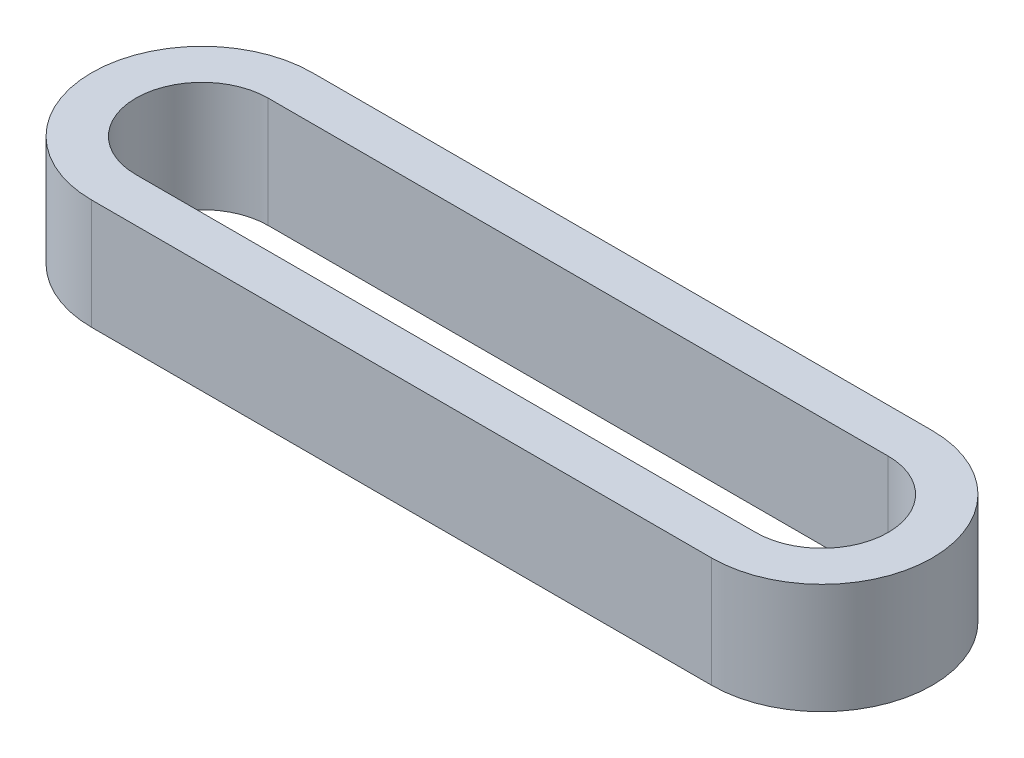
ISO-10303-21;
HEADER;
FILE_DESCRIPTION(('STEP AP214'),'2;1');
FILE_NAME('part.step','',(''),(''),'','','');
FILE_SCHEMA(('AUTOMOTIVE_DESIGN { 1 0 10303 214 1 1 1 1 }'));
ENDSEC;
DATA;
#1=APPLICATION_CONTEXT('core data for automotive mechanical design processes');
#2=APPLICATION_PROTOCOL_DEFINITION('international standard','automotive_design',2000,#1);
#3=PRODUCT_CONTEXT('',#1,'mechanical');
#4=PRODUCT('Part','Part','',(#3));
#5=PRODUCT_RELATED_PRODUCT_CATEGORY('part','',(#4));
#6=PRODUCT_DEFINITION_FORMATION('','',#4);
#7=PRODUCT_DEFINITION_CONTEXT('part definition',#1,'design');
#8=PRODUCT_DEFINITION('design','',#6,#7);
#9=PRODUCT_DEFINITION_SHAPE('','',#8);
#10=(LENGTH_UNIT() NAMED_UNIT(*) SI_UNIT(.MILLI.,.METRE.));
#11=(NAMED_UNIT(*) PLANE_ANGLE_UNIT() SI_UNIT($,.RADIAN.));
#12=(NAMED_UNIT(*) SI_UNIT($,.STERADIAN.) SOLID_ANGLE_UNIT());
#13=UNCERTAINTY_MEASURE_WITH_UNIT(LENGTH_MEASURE(1.E-05),#10,'distance_accuracy_value','');
#14=(GEOMETRIC_REPRESENTATION_CONTEXT(3) GLOBAL_UNCERTAINTY_ASSIGNED_CONTEXT((#13)) GLOBAL_UNIT_ASSIGNED_CONTEXT((#10,
#11,#12)) REPRESENTATION_CONTEXT('',''));
#15=CARTESIAN_POINT('',(0.,0.,0.));
#16=DIRECTION('',(0.,0.,1.));
#17=DIRECTION('',(1.,0.,0.));
#18=AXIS2_PLACEMENT_3D('',#15,#16,#17);
#19=CARTESIAN_POINT('',(-7.025,2.5,0.));
#20=DIRECTION('',(0.,1.,0.));
#21=DIRECTION('',(0.,0.,1.));
#22=AXIS2_PLACEMENT_3D('',#19,#20,#21);
#23=PLANE('',#22);
#24=CARTESIAN_POINT('',(-7.025,2.5,0.));
#25=DIRECTION('',(0.,1.,0.));
#26=DIRECTION('',(0.,0.,1.));
#27=AXIS2_PLACEMENT_3D('',#24,#25,#26);
#28=CIRCLE('',#27,2.5);
#29=CARTESIAN_POINT('',(-7.025,2.5,-2.5));
#30=VERTEX_POINT('',#29);
#31=CARTESIAN_POINT('',(-7.025,2.5,2.5));
#32=VERTEX_POINT('',#31);
#33=EDGE_CURVE('E177',#30,#32,#28,.T.);
#34=ORIENTED_EDGE('',*,*,#33,.T.);
#35=DIRECTION('',(1.,0.,0.));
#36=VECTOR('',#35,1.);
#37=CARTESIAN_POINT('',(-7.025,2.5,2.5));
#38=LINE('',#37,#36);
#39=CARTESIAN_POINT('',(7.025,2.5,2.5));
#40=VERTEX_POINT('',#39);
#41=EDGE_CURVE('E181',#32,#40,#38,.T.);
#42=ORIENTED_EDGE('',*,*,#41,.T.);
#43=CARTESIAN_POINT('',(7.025,2.5,0.));
#44=DIRECTION('',(0.,1.,0.));
#45=DIRECTION('',(0.,0.,1.));
#46=AXIS2_PLACEMENT_3D('',#43,#44,#45);
#47=CIRCLE('',#46,2.5);
#48=CARTESIAN_POINT('',(7.025,2.5,-2.5));
#49=VERTEX_POINT('',#48);
#50=EDGE_CURVE('E185',#40,#49,#47,.T.);
#51=ORIENTED_EDGE('',*,*,#50,.T.);
#52=DIRECTION('',(-1.,0.,0.));
#53=VECTOR('',#52,1.);
#54=CARTESIAN_POINT('',(-7.025,2.5,-2.5));
#55=LINE('',#54,#53);
#56=EDGE_CURVE('E188',#49,#30,#55,.T.);
#57=ORIENTED_EDGE('',*,*,#56,.T.);
#58=EDGE_LOOP('',(#34,#42,#51,#57));
#59=FACE_BOUND('',#58,.T.);
#60=DIRECTION('',(1.,0.,0.));
#61=VECTOR('',#60,1.);
#62=CARTESIAN_POINT('',(-7.025,2.5,1.5));
#63=LINE('',#62,#61);
#64=CARTESIAN_POINT('',(-7.025,2.5,1.5));
#65=VERTEX_POINT('',#64);
#66=CARTESIAN_POINT('',(7.025,2.5,1.5));
#67=VERTEX_POINT('',#66);
#68=EDGE_CURVE('E138',#65,#67,#63,.T.);
#69=ORIENTED_EDGE('',*,*,#68,.F.);
#70=CARTESIAN_POINT('',(-7.025,2.5,0.));
#71=DIRECTION('',(0.,1.,0.));
#72=DIRECTION('',(1.,0.,0.));
#73=AXIS2_PLACEMENT_3D('',#70,#71,#72);
#74=CIRCLE('',#73,1.5);
#75=CARTESIAN_POINT('',(-7.025,2.5,-1.5));
#76=VERTEX_POINT('',#75);
#77=EDGE_CURVE('E129',#76,#65,#74,.T.);
#78=ORIENTED_EDGE('',*,*,#77,.F.);
#79=DIRECTION('',(-1.,0.,0.));
#80=VECTOR('',#79,1.);
#81=CARTESIAN_POINT('',(-7.025,2.5,-1.5));
#82=LINE('',#81,#80);
#83=CARTESIAN_POINT('',(7.025,2.5,-1.5));
#84=VERTEX_POINT('',#83);
#85=EDGE_CURVE('E155',#84,#76,#82,.T.);
#86=ORIENTED_EDGE('',*,*,#85,.F.);
#87=CARTESIAN_POINT('',(7.025,2.5,0.));
#88=DIRECTION('',(0.,1.,0.));
#89=DIRECTION('',(1.,0.,0.));
#90=AXIS2_PLACEMENT_3D('',#87,#88,#89);
#91=CIRCLE('',#90,1.5);
#92=EDGE_CURVE('E151',#67,#84,#91,.T.);
#93=ORIENTED_EDGE('',*,*,#92,.F.);
#94=EDGE_LOOP('',(#69,#78,#86,#93));
#95=FACE_BOUND('',#94,.T.);
#96=ADVANCED_FACE('F63',(#59,#95),#23,.T.);
#97=CARTESIAN_POINT('',(-7.025,0.,0.));
#98=DIRECTION('',(0.,1.,0.));
#99=DIRECTION('',(0.,0.,1.));
#100=AXIS2_PLACEMENT_3D('',#97,#98,#99);
#101=PLANE('',#100);
#102=CARTESIAN_POINT('',(-7.025,0.,0.));
#103=DIRECTION('',(0.,1.,0.));
#104=DIRECTION('',(0.,0.,1.));
#105=AXIS2_PLACEMENT_3D('',#102,#103,#104);
#106=CIRCLE('',#105,2.5);
#107=CARTESIAN_POINT('',(-7.025,0.,-2.5));
#108=VERTEX_POINT('',#107);
#109=CARTESIAN_POINT('',(-7.025,0.,2.5));
#110=VERTEX_POINT('',#109);
#111=EDGE_CURVE('E147',#108,#110,#106,.T.);
#112=ORIENTED_EDGE('',*,*,#111,.F.);
#113=DIRECTION('',(-1.,0.,0.));
#114=VECTOR('',#113,1.);
#115=CARTESIAN_POINT('',(-7.025,0.,-2.5));
#116=LINE('',#115,#114);
#117=CARTESIAN_POINT('',(7.025,0.,-2.5));
#118=VERTEX_POINT('',#117);
#119=EDGE_CURVE('E182',#118,#108,#116,.T.);
#120=ORIENTED_EDGE('',*,*,#119,.F.);
#121=CARTESIAN_POINT('',(7.025,0.,0.));
#122=DIRECTION('',(0.,1.,0.));
#123=DIRECTION('',(0.,0.,1.));
#124=AXIS2_PLACEMENT_3D('',#121,#122,#123);
#125=CIRCLE('',#124,2.5);
#126=CARTESIAN_POINT('',(7.025,0.,2.5));
#127=VERTEX_POINT('',#126);
#128=EDGE_CURVE('E198',#127,#118,#125,.T.);
#129=ORIENTED_EDGE('',*,*,#128,.F.);
#130=DIRECTION('',(1.,0.,0.));
#131=VECTOR('',#130,1.);
#132=CARTESIAN_POINT('',(-7.025,0.,2.5));
#133=LINE('',#132,#131);
#134=EDGE_CURVE('E195',#110,#127,#133,.T.);
#135=ORIENTED_EDGE('',*,*,#134,.F.);
#136=EDGE_LOOP('',(#112,#120,#129,#135));
#137=FACE_BOUND('',#136,.T.);
#138=CARTESIAN_POINT('',(-7.025,0.,0.));
#139=DIRECTION('',(0.,1.,0.));
#140=DIRECTION('',(1.,0.,0.));
#141=AXIS2_PLACEMENT_3D('',#138,#139,#140);
#142=CIRCLE('',#141,1.5);
#143=CARTESIAN_POINT('',(-7.025,0.,-1.5));
#144=VERTEX_POINT('',#143);
#145=CARTESIAN_POINT('',(-7.025,0.,1.5));
#146=VERTEX_POINT('',#145);
#147=EDGE_CURVE('E87',#144,#146,#142,.T.);
#148=ORIENTED_EDGE('',*,*,#147,.T.);
#149=DIRECTION('',(1.,0.,0.));
#150=VECTOR('',#149,1.);
#151=CARTESIAN_POINT('',(-7.025,0.,1.5));
#152=LINE('',#151,#150);
#153=CARTESIAN_POINT('',(7.025,0.,1.5));
#154=VERTEX_POINT('',#153);
#155=EDGE_CURVE('E145',#146,#154,#152,.T.);
#156=ORIENTED_EDGE('',*,*,#155,.T.);
#157=CARTESIAN_POINT('',(7.025,0.,0.));
#158=DIRECTION('',(0.,1.,0.));
#159=DIRECTION('',(1.,0.,0.));
#160=AXIS2_PLACEMENT_3D('',#157,#158,#159);
#161=CIRCLE('',#160,1.5);
#162=CARTESIAN_POINT('',(7.025,0.,-1.5));
#163=VERTEX_POINT('',#162);
#164=EDGE_CURVE('E164',#154,#163,#161,.T.);
#165=ORIENTED_EDGE('',*,*,#164,.T.);
#166=DIRECTION('',(-1.,0.,0.));
#167=VECTOR('',#166,1.);
#168=CARTESIAN_POINT('',(-7.025,0.,-1.5));
#169=LINE('',#168,#167);
#170=EDGE_CURVE('E139',#163,#144,#169,.T.);
#171=ORIENTED_EDGE('',*,*,#170,.T.);
#172=EDGE_LOOP('',(#148,#156,#165,#171));
#173=FACE_BOUND('',#172,.T.);
#174=ADVANCED_FACE('F221',(#137,#173),#101,.F.);
#175=CARTESIAN_POINT('',(-7.025,2.5,0.));
#176=DIRECTION('',(0.,-1.,0.));
#177=DIRECTION('',(0.,0.,-1.));
#178=AXIS2_PLACEMENT_3D('',#175,#176,#177);
#179=CYLINDRICAL_SURFACE('',#178,2.5);
#180=ORIENTED_EDGE('',*,*,#111,.T.);
#181=DIRECTION('',(0.,-1.,0.));
#182=VECTOR('',#181,1.);
#183=CARTESIAN_POINT('',(-7.025,2.5,2.5));
#184=LINE('',#183,#182);
#185=EDGE_CURVE('E12',#32,#110,#184,.T.);
#186=ORIENTED_EDGE('',*,*,#185,.F.);
#187=ORIENTED_EDGE('',*,*,#33,.F.);
#188=DIRECTION('',(0.,-1.,0.));
#189=VECTOR('',#188,1.);
#190=CARTESIAN_POINT('',(-7.025,2.5,-2.5));
#191=LINE('',#190,#189);
#192=EDGE_CURVE('E191',#30,#108,#191,.T.);
#193=ORIENTED_EDGE('',*,*,#192,.T.);
#194=EDGE_LOOP('',(#180,#186,#187,#193));
#195=FACE_BOUND('',#194,.T.);
#196=ADVANCED_FACE('F65',(#195),#179,.T.);
#197=CARTESIAN_POINT('',(-7.025,2.5,2.5));
#198=DIRECTION('',(0.,0.,-1.));
#199=DIRECTION('',(-1.,0.,0.));
#200=AXIS2_PLACEMENT_3D('',#197,#198,#199);
#201=PLANE('',#200);
#202=ORIENTED_EDGE('',*,*,#134,.T.);
#203=DIRECTION('',(0.,-1.,0.));
#204=VECTOR('',#203,1.);
#205=CARTESIAN_POINT('',(7.025,2.5,2.5));
#206=LINE('',#205,#204);
#207=EDGE_CURVE('E72',#40,#127,#206,.T.);
#208=ORIENTED_EDGE('',*,*,#207,.F.);
#209=ORIENTED_EDGE('',*,*,#41,.F.);
#210=ORIENTED_EDGE('',*,*,#185,.T.);
#211=EDGE_LOOP('',(#202,#208,#209,#210));
#212=FACE_BOUND('',#211,.T.);
#213=ADVANCED_FACE('F231',(#212),#201,.F.);
#214=CARTESIAN_POINT('',(7.025,2.5,0.));
#215=DIRECTION('',(0.,-1.,0.));
#216=DIRECTION('',(0.,0.,-1.));
#217=AXIS2_PLACEMENT_3D('',#214,#215,#216);
#218=CYLINDRICAL_SURFACE('',#217,2.5);
#219=ORIENTED_EDGE('',*,*,#128,.T.);
#220=DIRECTION('',(0.,-1.,0.));
#221=VECTOR('',#220,1.);
#222=CARTESIAN_POINT('',(7.025,2.5,-2.5));
#223=LINE('',#222,#221);
#224=EDGE_CURVE('E206',#49,#118,#223,.T.);
#225=ORIENTED_EDGE('',*,*,#224,.F.);
#226=ORIENTED_EDGE('',*,*,#50,.F.);
#227=ORIENTED_EDGE('',*,*,#207,.T.);
#228=EDGE_LOOP('',(#219,#225,#226,#227));
#229=FACE_BOUND('',#228,.T.);
#230=ADVANCED_FACE('F215',(#229),#218,.T.);
#231=CARTESIAN_POINT('',(-7.025,2.5,-2.5));
#232=DIRECTION('',(0.,0.,1.));
#233=DIRECTION('',(1.,0.,0.));
#234=AXIS2_PLACEMENT_3D('',#231,#232,#233);
#235=PLANE('',#234);
#236=ORIENTED_EDGE('',*,*,#119,.T.);
#237=ORIENTED_EDGE('',*,*,#192,.F.);
#238=ORIENTED_EDGE('',*,*,#56,.F.);
#239=ORIENTED_EDGE('',*,*,#224,.T.);
#240=EDGE_LOOP('',(#236,#237,#238,#239));
#241=FACE_BOUND('',#240,.T.);
#242=ADVANCED_FACE('F225',(#241),#235,.F.);
#243=CARTESIAN_POINT('',(-7.025,2.5,0.));
#244=DIRECTION('',(0.,-1.,0.));
#245=DIRECTION('',(0.,0.,-1.));
#246=AXIS2_PLACEMENT_3D('',#243,#244,#245);
#247=CYLINDRICAL_SURFACE('',#246,1.5);
#248=ORIENTED_EDGE('',*,*,#147,.F.);
#249=DIRECTION('',(0.,-1.,0.));
#250=VECTOR('',#249,1.);
#251=CARTESIAN_POINT('',(-7.025,2.5,-1.5));
#252=LINE('',#251,#250);
#253=EDGE_CURVE('E133',#76,#144,#252,.T.);
#254=ORIENTED_EDGE('',*,*,#253,.F.);
#255=ORIENTED_EDGE('',*,*,#77,.T.);
#256=DIRECTION('',(0.,-1.,0.));
#257=VECTOR('',#256,1.);
#258=CARTESIAN_POINT('',(-7.025,2.5,1.5));
#259=LINE('',#258,#257);
#260=EDGE_CURVE('E132',#65,#146,#259,.T.);
#261=ORIENTED_EDGE('',*,*,#260,.T.);
#262=EDGE_LOOP('',(#248,#254,#255,#261));
#263=FACE_BOUND('',#262,.T.);
#264=ADVANCED_FACE('F131',(#263),#247,.F.);
#265=CARTESIAN_POINT('',(-7.025,2.5,1.5));
#266=DIRECTION('',(0.,0.,-1.));
#267=DIRECTION('',(-1.,0.,0.));
#268=AXIS2_PLACEMENT_3D('',#265,#266,#267);
#269=PLANE('',#268);
#270=ORIENTED_EDGE('',*,*,#155,.F.);
#271=ORIENTED_EDGE('',*,*,#260,.F.);
#272=ORIENTED_EDGE('',*,*,#68,.T.);
#273=DIRECTION('',(0.,-1.,0.));
#274=VECTOR('',#273,1.);
#275=CARTESIAN_POINT('',(7.025,2.5,1.5));
#276=LINE('',#275,#274);
#277=EDGE_CURVE('E148',#67,#154,#276,.T.);
#278=ORIENTED_EDGE('',*,*,#277,.T.);
#279=EDGE_LOOP('',(#270,#271,#272,#278));
#280=FACE_BOUND('',#279,.T.);
#281=ADVANCED_FACE('F142',(#280),#269,.T.);
#282=CARTESIAN_POINT('',(7.025,2.5,0.));
#283=DIRECTION('',(0.,-1.,0.));
#284=DIRECTION('',(0.,0.,-1.));
#285=AXIS2_PLACEMENT_3D('',#282,#283,#284);
#286=CYLINDRICAL_SURFACE('',#285,1.5);
#287=ORIENTED_EDGE('',*,*,#164,.F.);
#288=ORIENTED_EDGE('',*,*,#277,.F.);
#289=ORIENTED_EDGE('',*,*,#92,.T.);
#290=DIRECTION('',(0.,-1.,0.));
#291=VECTOR('',#290,1.);
#292=CARTESIAN_POINT('',(7.025,2.5,-1.5));
#293=LINE('',#292,#291);
#294=EDGE_CURVE('E79',#84,#163,#293,.T.);
#295=ORIENTED_EDGE('',*,*,#294,.T.);
#296=EDGE_LOOP('',(#287,#288,#289,#295));
#297=FACE_BOUND('',#296,.T.);
#298=ADVANCED_FACE('F254',(#297),#286,.F.);
#299=CARTESIAN_POINT('',(-7.025,2.5,-1.5));
#300=DIRECTION('',(0.,0.,1.));
#301=DIRECTION('',(1.,0.,0.));
#302=AXIS2_PLACEMENT_3D('',#299,#300,#301);
#303=PLANE('',#302);
#304=ORIENTED_EDGE('',*,*,#170,.F.);
#305=ORIENTED_EDGE('',*,*,#294,.F.);
#306=ORIENTED_EDGE('',*,*,#85,.T.);
#307=ORIENTED_EDGE('',*,*,#253,.T.);
#308=EDGE_LOOP('',(#304,#305,#306,#307));
#309=FACE_BOUND('',#308,.T.);
#310=ADVANCED_FACE('F258',(#309),#303,.T.);
#311=CLOSED_SHELL('',(#96,#174,#196,#213,#230,#242,#264,#281,#298,#310));
#312=MANIFOLD_SOLID_BREP('B2',#311);
#313=ADVANCED_BREP_SHAPE_REPRESENTATION('',(#18,#312),#14);
#314=SHAPE_DEFINITION_REPRESENTATION(#9,#313);
ENDSEC;
END-ISO-10303-21;
